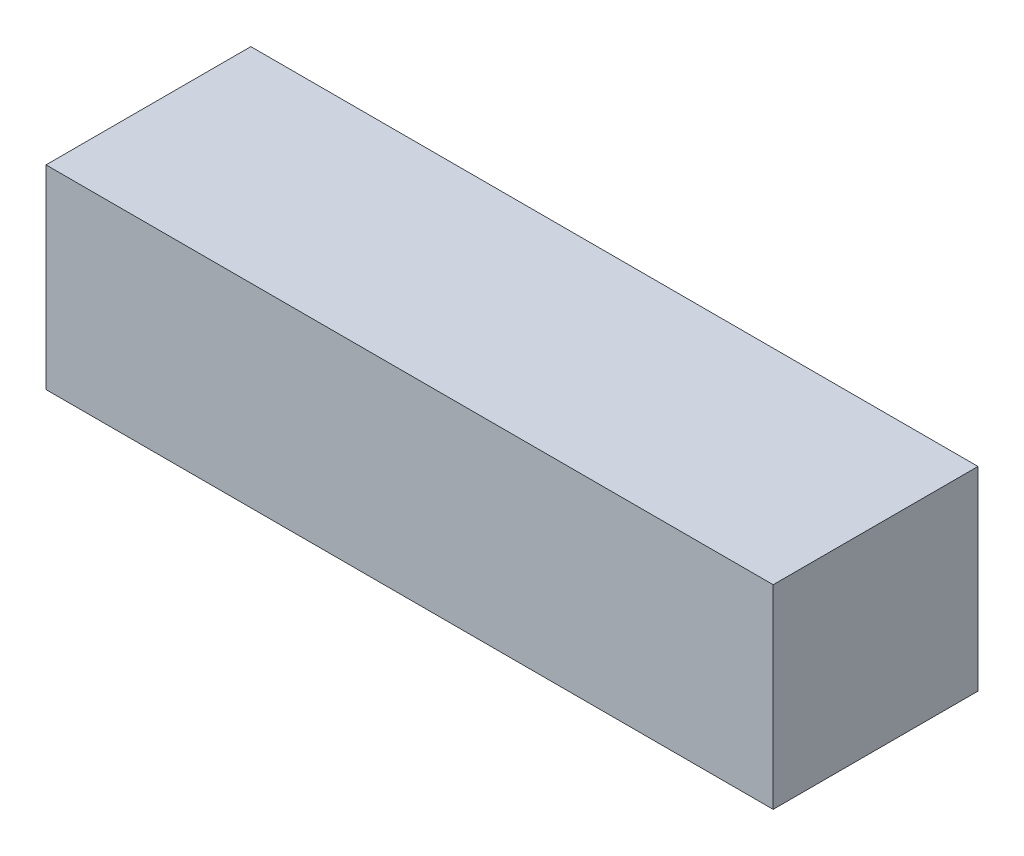
ISO-10303-21;
HEADER;
FILE_DESCRIPTION(('STEP AP214'),'2;1');
FILE_NAME('part.step','',(''),(''),'','','');
FILE_SCHEMA(('AUTOMOTIVE_DESIGN { 1 0 10303 214 1 1 1 1 }'));
ENDSEC;
DATA;
#1=APPLICATION_CONTEXT('core data for automotive mechanical design processes');
#2=APPLICATION_PROTOCOL_DEFINITION('international standard','automotive_design',2000,#1);
#3=PRODUCT_CONTEXT('',#1,'mechanical');
#4=PRODUCT('Part','Part','',(#3));
#5=PRODUCT_RELATED_PRODUCT_CATEGORY('part','',(#4));
#6=PRODUCT_DEFINITION_FORMATION('','',#4);
#7=PRODUCT_DEFINITION_CONTEXT('part definition',#1,'design');
#8=PRODUCT_DEFINITION('design','',#6,#7);
#9=PRODUCT_DEFINITION_SHAPE('','',#8);
#10=(LENGTH_UNIT() NAMED_UNIT(*) SI_UNIT(.MILLI.,.METRE.));
#11=(NAMED_UNIT(*) PLANE_ANGLE_UNIT() SI_UNIT($,.RADIAN.));
#12=(NAMED_UNIT(*) SI_UNIT($,.STERADIAN.) SOLID_ANGLE_UNIT());
#13=UNCERTAINTY_MEASURE_WITH_UNIT(LENGTH_MEASURE(1.E-05),#10,'distance_accuracy_value','');
#14=(GEOMETRIC_REPRESENTATION_CONTEXT(3) GLOBAL_UNCERTAINTY_ASSIGNED_CONTEXT((#13)) GLOBAL_UNIT_ASSIGNED_CONTEXT((#10,
#11,#12)) REPRESENTATION_CONTEXT('',''));
#15=CARTESIAN_POINT('',(0.,0.,0.));
#16=DIRECTION('',(0.,0.,1.));
#17=DIRECTION('',(1.,0.,0.));
#18=AXIS2_PLACEMENT_3D('',#15,#16,#17);
#19=CARTESIAN_POINT('',(71.,38.,-20.));
#20=DIRECTION('',(-1.,0.,0.));
#21=DIRECTION('',(0.,0.,1.));
#22=AXIS2_PLACEMENT_3D('',#19,#20,#21);
#23=PLANE('',#22);
#24=DIRECTION('',(0.,0.,-1.));
#25=VECTOR('',#24,1.);
#26=CARTESIAN_POINT('',(71.,0.,-20.));
#27=LINE('',#26,#25);
#28=CARTESIAN_POINT('',(71.,0.,20.));
#29=VERTEX_POINT('',#28);
#30=CARTESIAN_POINT('',(71.,0.,-20.));
#31=VERTEX_POINT('',#30);
#32=EDGE_CURVE('E99',#29,#31,#27,.T.);
#33=ORIENTED_EDGE('',*,*,#32,.T.);
#34=DIRECTION('',(0.,-1.,0.));
#35=VECTOR('',#34,1.);
#36=CARTESIAN_POINT('',(71.,38.,-20.));
#37=LINE('',#36,#35);
#38=CARTESIAN_POINT('',(71.,38.,-20.));
#39=VERTEX_POINT('',#38);
#40=EDGE_CURVE('E11',#39,#31,#37,.T.);
#41=ORIENTED_EDGE('',*,*,#40,.F.);
#42=DIRECTION('',(0.,0.,-1.));
#43=VECTOR('',#42,1.);
#44=CARTESIAN_POINT('',(71.,38.,-20.));
#45=LINE('',#44,#43);
#46=CARTESIAN_POINT('',(71.,38.,20.));
#47=VERTEX_POINT('',#46);
#48=EDGE_CURVE('E87',#47,#39,#45,.T.);
#49=ORIENTED_EDGE('',*,*,#48,.F.);
#50=DIRECTION('',(0.,-1.,0.));
#51=VECTOR('',#50,1.);
#52=CARTESIAN_POINT('',(71.,38.,20.));
#53=LINE('',#52,#51);
#54=EDGE_CURVE('E95',#47,#29,#53,.T.);
#55=ORIENTED_EDGE('',*,*,#54,.T.);
#56=EDGE_LOOP('',(#33,#41,#49,#55));
#57=FACE_BOUND('',#56,.T.);
#58=ADVANCED_FACE('F36',(#57),#23,.F.);
#59=CARTESIAN_POINT('',(-71.,38.,-20.));
#60=DIRECTION('',(0.,0.,1.));
#61=DIRECTION('',(1.,0.,0.));
#62=AXIS2_PLACEMENT_3D('',#59,#60,#61);
#63=PLANE('',#62);
#64=DIRECTION('',(-1.,0.,0.));
#65=VECTOR('',#64,1.);
#66=CARTESIAN_POINT('',(-71.,0.,-20.));
#67=LINE('',#66,#65);
#68=CARTESIAN_POINT('',(-71.,0.,-20.));
#69=VERTEX_POINT('',#68);
#70=EDGE_CURVE('E91',#31,#69,#67,.T.);
#71=ORIENTED_EDGE('',*,*,#70,.T.);
#72=DIRECTION('',(0.,-1.,0.));
#73=VECTOR('',#72,1.);
#74=CARTESIAN_POINT('',(-71.,38.,-20.));
#75=LINE('',#74,#73);
#76=CARTESIAN_POINT('',(-71.,38.,-20.));
#77=VERTEX_POINT('',#76);
#78=EDGE_CURVE('E44',#77,#69,#75,.T.);
#79=ORIENTED_EDGE('',*,*,#78,.F.);
#80=DIRECTION('',(-1.,0.,0.));
#81=VECTOR('',#80,1.);
#82=CARTESIAN_POINT('',(-71.,38.,-20.));
#83=LINE('',#82,#81);
#84=EDGE_CURVE('E82',#39,#77,#83,.T.);
#85=ORIENTED_EDGE('',*,*,#84,.F.);
#86=ORIENTED_EDGE('',*,*,#40,.T.);
#87=EDGE_LOOP('',(#71,#79,#85,#86));
#88=FACE_BOUND('',#87,.T.);
#89=ADVANCED_FACE('F90',(#88),#63,.F.);
#90=CARTESIAN_POINT('',(-71.,38.,-20.));
#91=DIRECTION('',(1.,0.,0.));
#92=DIRECTION('',(0.,0.,-1.));
#93=AXIS2_PLACEMENT_3D('',#90,#91,#92);
#94=PLANE('',#93);
#95=DIRECTION('',(0.,0.,1.));
#96=VECTOR('',#95,1.);
#97=CARTESIAN_POINT('',(-71.,0.,-20.));
#98=LINE('',#97,#96);
#99=CARTESIAN_POINT('',(-71.,0.,20.));
#100=VERTEX_POINT('',#99);
#101=EDGE_CURVE('E69',#69,#100,#98,.T.);
#102=ORIENTED_EDGE('',*,*,#101,.T.);
#103=DIRECTION('',(0.,-1.,0.));
#104=VECTOR('',#103,1.);
#105=CARTESIAN_POINT('',(-71.,38.,20.));
#106=LINE('',#105,#104);
#107=CARTESIAN_POINT('',(-71.,38.,20.));
#108=VERTEX_POINT('',#107);
#109=EDGE_CURVE('E92',#108,#100,#106,.T.);
#110=ORIENTED_EDGE('',*,*,#109,.F.);
#111=DIRECTION('',(0.,0.,1.));
#112=VECTOR('',#111,1.);
#113=CARTESIAN_POINT('',(-71.,38.,-20.));
#114=LINE('',#113,#112);
#115=EDGE_CURVE('E85',#77,#108,#114,.T.);
#116=ORIENTED_EDGE('',*,*,#115,.F.);
#117=ORIENTED_EDGE('',*,*,#78,.T.);
#118=EDGE_LOOP('',(#102,#110,#116,#117));
#119=FACE_BOUND('',#118,.T.);
#120=ADVANCED_FACE('F93',(#119),#94,.F.);
#121=CARTESIAN_POINT('',(-71.,38.,20.));
#122=DIRECTION('',(0.,0.,-1.));
#123=DIRECTION('',(-1.,0.,0.));
#124=AXIS2_PLACEMENT_3D('',#121,#122,#123);
#125=PLANE('',#124);
#126=DIRECTION('',(1.,0.,0.));
#127=VECTOR('',#126,1.);
#128=CARTESIAN_POINT('',(-71.,0.,20.));
#129=LINE('',#128,#127);
#130=EDGE_CURVE('E75',#100,#29,#129,.T.);
#131=ORIENTED_EDGE('',*,*,#130,.T.);
#132=ORIENTED_EDGE('',*,*,#54,.F.);
#133=DIRECTION('',(1.,0.,0.));
#134=VECTOR('',#133,1.);
#135=CARTESIAN_POINT('',(-71.,38.,20.));
#136=LINE('',#135,#134);
#137=EDGE_CURVE('E52',#108,#47,#136,.T.);
#138=ORIENTED_EDGE('',*,*,#137,.F.);
#139=ORIENTED_EDGE('',*,*,#109,.T.);
#140=EDGE_LOOP('',(#131,#132,#138,#139));
#141=FACE_BOUND('',#140,.T.);
#142=ADVANCED_FACE('F106',(#141),#125,.F.);
#143=CARTESIAN_POINT('',(0.,38.,0.));
#144=DIRECTION('',(0.,1.,0.));
#145=DIRECTION('',(0.,0.,1.));
#146=AXIS2_PLACEMENT_3D('',#143,#144,#145);
#147=PLANE('',#146);
#148=ORIENTED_EDGE('',*,*,#48,.T.);
#149=ORIENTED_EDGE('',*,*,#84,.T.);
#150=ORIENTED_EDGE('',*,*,#115,.T.);
#151=ORIENTED_EDGE('',*,*,#137,.T.);
#152=EDGE_LOOP('',(#148,#149,#150,#151));
#153=FACE_BOUND('',#152,.T.);
#154=ADVANCED_FACE('F83',(#153),#147,.T.);
#155=CARTESIAN_POINT('',(0.,0.,0.));
#156=DIRECTION('',(0.,1.,0.));
#157=DIRECTION('',(0.,0.,1.));
#158=AXIS2_PLACEMENT_3D('',#155,#156,#157);
#159=PLANE('',#158);
#160=ORIENTED_EDGE('',*,*,#32,.F.);
#161=ORIENTED_EDGE('',*,*,#130,.F.);
#162=ORIENTED_EDGE('',*,*,#101,.F.);
#163=ORIENTED_EDGE('',*,*,#70,.F.);
#164=EDGE_LOOP('',(#160,#161,#162,#163));
#165=FACE_BOUND('',#164,.T.);
#166=ADVANCED_FACE('F109',(#165),#159,.F.);
#167=CLOSED_SHELL('',(#58,#89,#120,#142,#154,#166));
#168=MANIFOLD_SOLID_BREP('B2',#167);
#169=ADVANCED_BREP_SHAPE_REPRESENTATION('',(#18,#168),#14);
#170=SHAPE_DEFINITION_REPRESENTATION(#9,#169);
ENDSEC;
END-ISO-10303-21;
